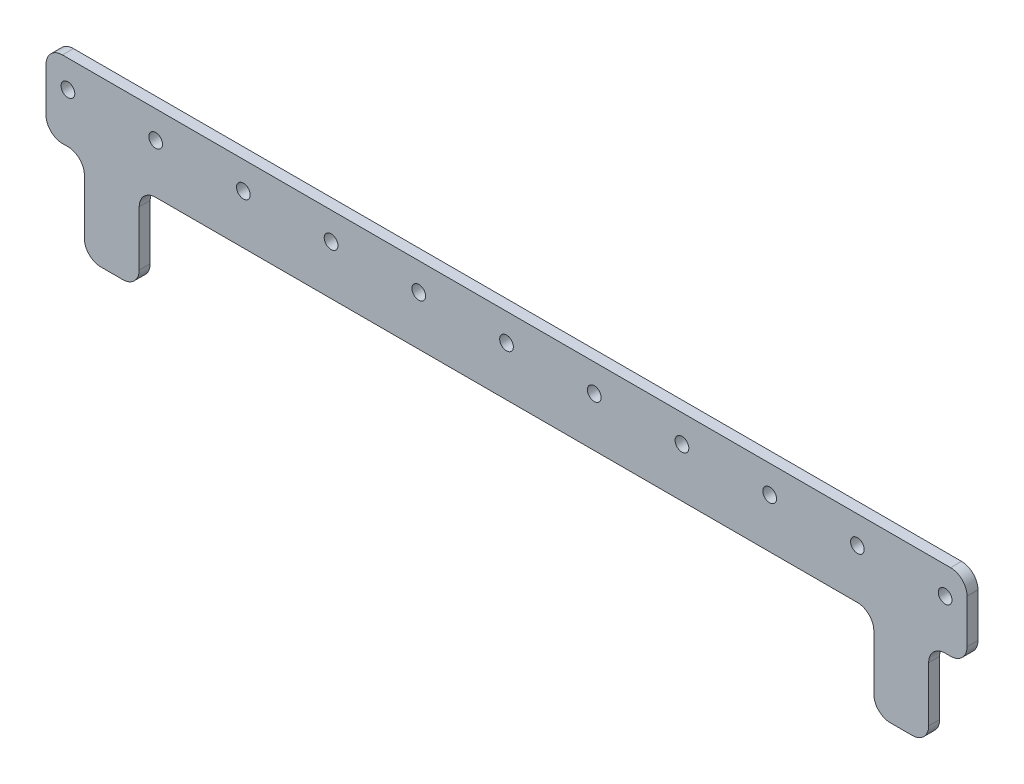
ISO-10303-21;
HEADER;
FILE_DESCRIPTION(('STEP AP214'),'2;1');
FILE_NAME('part.step','',(''),(''),'','','');
FILE_SCHEMA(('AUTOMOTIVE_DESIGN { 1 0 10303 214 1 1 1 1 }'));
ENDSEC;
DATA;
#1=APPLICATION_CONTEXT('core data for automotive mechanical design processes');
#2=APPLICATION_PROTOCOL_DEFINITION('international standard','automotive_design',2000,#1);
#3=PRODUCT_CONTEXT('',#1,'mechanical');
#4=PRODUCT('Part','Part','',(#3));
#5=PRODUCT_RELATED_PRODUCT_CATEGORY('part','',(#4));
#6=PRODUCT_DEFINITION_FORMATION('','',#4);
#7=PRODUCT_DEFINITION_CONTEXT('part definition',#1,'design');
#8=PRODUCT_DEFINITION('design','',#6,#7);
#9=PRODUCT_DEFINITION_SHAPE('','',#8);
#10=(LENGTH_UNIT() NAMED_UNIT(*) SI_UNIT(.MILLI.,.METRE.));
#11=(NAMED_UNIT(*) PLANE_ANGLE_UNIT() SI_UNIT($,.RADIAN.));
#12=(NAMED_UNIT(*) SI_UNIT($,.STERADIAN.) SOLID_ANGLE_UNIT());
#13=UNCERTAINTY_MEASURE_WITH_UNIT(LENGTH_MEASURE(1.E-05),#10,'distance_accuracy_value','');
#14=(GEOMETRIC_REPRESENTATION_CONTEXT(3) GLOBAL_UNCERTAINTY_ASSIGNED_CONTEXT((#13)) GLOBAL_UNIT_ASSIGNED_CONTEXT((#10,
#11,#12)) REPRESENTATION_CONTEXT('',''));
#15=CARTESIAN_POINT('',(0.,0.,0.));
#16=DIRECTION('',(0.,0.,1.));
#17=DIRECTION('',(1.,0.,0.));
#18=AXIS2_PLACEMENT_3D('',#15,#16,#17);
#19=CARTESIAN_POINT('',(-84.,-7.,-2.));
#20=DIRECTION('',(0.,-1.,0.));
#21=DIRECTION('',(0.,0.,-1.));
#22=AXIS2_PLACEMENT_3D('',#19,#20,#21);
#23=PLANE('',#22);
#24=DIRECTION('',(1.,0.,0.));
#25=VECTOR('',#24,1.);
#26=CARTESIAN_POINT('',(-84.,-7.,0.));
#27=LINE('',#26,#25);
#28=CARTESIAN_POINT('',(79.9999999999999,-7.,0.));
#29=VERTEX_POINT('',#28);
#30=CARTESIAN_POINT('',(80.9999999999999,-7.,0.));
#31=VERTEX_POINT('',#30);
#32=EDGE_CURVE('E324',#29,#31,#27,.T.);
#33=ORIENTED_EDGE('',*,*,#32,.F.);
#34=DIRECTION('',(0.,0.,1.));
#35=VECTOR('',#34,1.);
#36=CARTESIAN_POINT('',(80.,-7.,-2.));
#37=LINE('',#36,#35);
#38=CARTESIAN_POINT('',(79.9999999999999,-7.,-2.));
#39=VERTEX_POINT('',#38);
#40=EDGE_CURVE('E257',#29,#39,#37,.F.);
#41=ORIENTED_EDGE('',*,*,#40,.T.);
#42=DIRECTION('',(1.,0.,0.));
#43=VECTOR('',#42,1.);
#44=CARTESIAN_POINT('',(-84.,-7.,-2.));
#45=LINE('',#44,#43);
#46=CARTESIAN_POINT('',(80.9999999999999,-7.,-2.));
#47=VERTEX_POINT('',#46);
#48=EDGE_CURVE('E345',#39,#47,#45,.T.);
#49=ORIENTED_EDGE('',*,*,#48,.T.);
#50=DIRECTION('',(0.,0.,1.));
#51=VECTOR('',#50,1.);
#52=CARTESIAN_POINT('',(81.,-7.,-2.));
#53=LINE('',#52,#51);
#54=EDGE_CURVE('E254',#47,#31,#53,.T.);
#55=ORIENTED_EDGE('',*,*,#54,.T.);
#56=EDGE_LOOP('',(#33,#41,#49,#55));
#57=FACE_BOUND('',#56,.T.);
#58=ADVANCED_FACE('F35',(#57),#23,.T.);
#59=CARTESIAN_POINT('',(-81.,-7.,-2.));
#60=VERTEX_POINT('',#59);
#61=CARTESIAN_POINT('',(-80.,-7.,-2.));
#62=VERTEX_POINT('',#61);
#63=EDGE_CURVE('E394',#60,#62,#45,.T.);
#64=ORIENTED_EDGE('',*,*,#63,.T.);
#65=DIRECTION('',(0.,0.,-1.));
#66=VECTOR('',#65,1.);
#67=CARTESIAN_POINT('',(-80.,-7.,0.));
#68=LINE('',#67,#66);
#69=CARTESIAN_POINT('',(-80.,-7.,0.));
#70=VERTEX_POINT('',#69);
#71=EDGE_CURVE('E242',#62,#70,#68,.F.);
#72=ORIENTED_EDGE('',*,*,#71,.T.);
#73=CARTESIAN_POINT('',(-81.,-7.,0.));
#74=VERTEX_POINT('',#73);
#75=EDGE_CURVE('E335',#74,#70,#27,.T.);
#76=ORIENTED_EDGE('',*,*,#75,.F.);
#77=DIRECTION('',(0.,0.,1.));
#78=VECTOR('',#77,1.);
#79=CARTESIAN_POINT('',(-81.,-7.,-2.));
#80=LINE('',#79,#78);
#81=EDGE_CURVE('E240',#74,#60,#80,.F.);
#82=ORIENTED_EDGE('',*,*,#81,.T.);
#83=EDGE_LOOP('',(#64,#72,#76,#82));
#84=FACE_BOUND('',#83,.T.);
#85=ADVANCED_FACE('F476',(#84),#23,.T.);
#86=CARTESIAN_POINT('',(-80.,2.,-2.));
#87=DIRECTION('',(0.,0.,1.));
#88=DIRECTION('',(1.,0.,0.));
#89=AXIS2_PLACEMENT_3D('',#86,#87,#88);
#90=CYLINDRICAL_SURFACE('',#89,1.25);
#91=CARTESIAN_POINT('',(-80.,2.,-2.));
#92=DIRECTION('',(0.,0.,1.));
#93=DIRECTION('',(1.,0.,0.));
#94=AXIS2_PLACEMENT_3D('',#91,#92,#93);
#95=CIRCLE('',#94,1.25);
#96=CARTESIAN_POINT('',(-78.75,2.,-2.));
#97=VERTEX_POINT('',#96);
#98=EDGE_CURVE('E455',#97,#97,#95,.T.);
#99=ORIENTED_EDGE('',*,*,#98,.F.);
#100=EDGE_LOOP('',(#99));
#101=FACE_BOUND('',#100,.T.);
#102=CARTESIAN_POINT('',(-80.,2.,0.));
#103=DIRECTION('',(0.,0.,1.));
#104=DIRECTION('',(1.,0.,0.));
#105=AXIS2_PLACEMENT_3D('',#102,#103,#104);
#106=CIRCLE('',#105,1.25);
#107=CARTESIAN_POINT('',(-78.75,2.,0.));
#108=VERTEX_POINT('',#107);
#109=EDGE_CURVE('E229',#108,#108,#106,.T.);
#110=ORIENTED_EDGE('',*,*,#109,.T.);
#111=EDGE_LOOP('',(#110));
#112=FACE_BOUND('',#111,.T.);
#113=ADVANCED_FACE('F460',(#101,#112),#90,.F.);
#114=CARTESIAN_POINT('',(-64.,2.,-2.));
#115=DIRECTION('',(0.,0.,1.));
#116=DIRECTION('',(1.,0.,0.));
#117=AXIS2_PLACEMENT_3D('',#114,#115,#116);
#118=CYLINDRICAL_SURFACE('',#117,1.25);
#119=CARTESIAN_POINT('',(-64.,2.,-2.));
#120=DIRECTION('',(0.,0.,1.));
#121=DIRECTION('',(1.,0.,0.));
#122=AXIS2_PLACEMENT_3D('',#119,#120,#121);
#123=CIRCLE('',#122,1.25);
#124=CARTESIAN_POINT('',(-62.75,2.,-2.));
#125=VERTEX_POINT('',#124);
#126=EDGE_CURVE('E449',#125,#125,#123,.T.);
#127=ORIENTED_EDGE('',*,*,#126,.F.);
#128=EDGE_LOOP('',(#127));
#129=FACE_BOUND('',#128,.T.);
#130=CARTESIAN_POINT('',(-64.,2.,0.));
#131=DIRECTION('',(0.,0.,1.));
#132=DIRECTION('',(1.,0.,0.));
#133=AXIS2_PLACEMENT_3D('',#130,#131,#132);
#134=CIRCLE('',#133,1.25);
#135=CARTESIAN_POINT('',(-62.75,2.,0.));
#136=VERTEX_POINT('',#135);
#137=EDGE_CURVE('E452',#136,#136,#134,.T.);
#138=ORIENTED_EDGE('',*,*,#137,.T.);
#139=EDGE_LOOP('',(#138));
#140=FACE_BOUND('',#139,.T.);
#141=ADVANCED_FACE('F613',(#129,#140),#118,.F.);
#142=CARTESIAN_POINT('',(-48.,2.,-2.));
#143=DIRECTION('',(0.,0.,1.));
#144=DIRECTION('',(1.,0.,0.));
#145=AXIS2_PLACEMENT_3D('',#142,#143,#144);
#146=CYLINDRICAL_SURFACE('',#145,1.25);
#147=CARTESIAN_POINT('',(-48.,2.,-2.));
#148=DIRECTION('',(0.,0.,1.));
#149=DIRECTION('',(1.,0.,0.));
#150=AXIS2_PLACEMENT_3D('',#147,#148,#149);
#151=CIRCLE('',#150,1.25);
#152=CARTESIAN_POINT('',(-46.75,2.,-2.));
#153=VERTEX_POINT('',#152);
#154=EDGE_CURVE('E443',#153,#153,#151,.T.);
#155=ORIENTED_EDGE('',*,*,#154,.F.);
#156=EDGE_LOOP('',(#155));
#157=FACE_BOUND('',#156,.T.);
#158=CARTESIAN_POINT('',(-48.,2.,0.));
#159=DIRECTION('',(0.,0.,1.));
#160=DIRECTION('',(1.,0.,0.));
#161=AXIS2_PLACEMENT_3D('',#158,#159,#160);
#162=CIRCLE('',#161,1.25);
#163=CARTESIAN_POINT('',(-46.75,2.,0.));
#164=VERTEX_POINT('',#163);
#165=EDGE_CURVE('E446',#164,#164,#162,.T.);
#166=ORIENTED_EDGE('',*,*,#165,.T.);
#167=EDGE_LOOP('',(#166));
#168=FACE_BOUND('',#167,.T.);
#169=ADVANCED_FACE('F609',(#157,#168),#146,.F.);
#170=CARTESIAN_POINT('',(-32.,2.,-2.));
#171=DIRECTION('',(0.,0.,1.));
#172=DIRECTION('',(1.,0.,0.));
#173=AXIS2_PLACEMENT_3D('',#170,#171,#172);
#174=CYLINDRICAL_SURFACE('',#173,1.25);
#175=CARTESIAN_POINT('',(-32.,2.,-2.));
#176=DIRECTION('',(0.,0.,1.));
#177=DIRECTION('',(1.,0.,0.));
#178=AXIS2_PLACEMENT_3D('',#175,#176,#177);
#179=CIRCLE('',#178,1.25);
#180=CARTESIAN_POINT('',(-30.75,2.,-2.));
#181=VERTEX_POINT('',#180);
#182=EDGE_CURVE('E437',#181,#181,#179,.T.);
#183=ORIENTED_EDGE('',*,*,#182,.F.);
#184=EDGE_LOOP('',(#183));
#185=FACE_BOUND('',#184,.T.);
#186=CARTESIAN_POINT('',(-32.,2.,0.));
#187=DIRECTION('',(0.,0.,1.));
#188=DIRECTION('',(1.,0.,0.));
#189=AXIS2_PLACEMENT_3D('',#186,#187,#188);
#190=CIRCLE('',#189,1.25);
#191=CARTESIAN_POINT('',(-30.75,2.,0.));
#192=VERTEX_POINT('',#191);
#193=EDGE_CURVE('E440',#192,#192,#190,.T.);
#194=ORIENTED_EDGE('',*,*,#193,.T.);
#195=EDGE_LOOP('',(#194));
#196=FACE_BOUND('',#195,.T.);
#197=ADVANCED_FACE('F605',(#185,#196),#174,.F.);
#198=CARTESIAN_POINT('',(-16.,2.,-2.));
#199=DIRECTION('',(0.,0.,1.));
#200=DIRECTION('',(1.,0.,0.));
#201=AXIS2_PLACEMENT_3D('',#198,#199,#200);
#202=CYLINDRICAL_SURFACE('',#201,1.25);
#203=CARTESIAN_POINT('',(-16.,2.,-2.));
#204=DIRECTION('',(0.,0.,1.));
#205=DIRECTION('',(1.,0.,0.));
#206=AXIS2_PLACEMENT_3D('',#203,#204,#205);
#207=CIRCLE('',#206,1.25);
#208=CARTESIAN_POINT('',(-14.75,2.,-2.));
#209=VERTEX_POINT('',#208);
#210=EDGE_CURVE('E431',#209,#209,#207,.T.);
#211=ORIENTED_EDGE('',*,*,#210,.F.);
#212=EDGE_LOOP('',(#211));
#213=FACE_BOUND('',#212,.T.);
#214=CARTESIAN_POINT('',(-16.,2.,0.));
#215=DIRECTION('',(0.,0.,1.));
#216=DIRECTION('',(1.,0.,0.));
#217=AXIS2_PLACEMENT_3D('',#214,#215,#216);
#218=CIRCLE('',#217,1.25);
#219=CARTESIAN_POINT('',(-14.75,2.,0.));
#220=VERTEX_POINT('',#219);
#221=EDGE_CURVE('E434',#220,#220,#218,.T.);
#222=ORIENTED_EDGE('',*,*,#221,.T.);
#223=EDGE_LOOP('',(#222));
#224=FACE_BOUND('',#223,.T.);
#225=ADVANCED_FACE('F601',(#213,#224),#202,.F.);
#226=CARTESIAN_POINT('',(0.,2.,-2.));
#227=DIRECTION('',(0.,0.,1.));
#228=DIRECTION('',(1.,0.,0.));
#229=AXIS2_PLACEMENT_3D('',#226,#227,#228);
#230=CYLINDRICAL_SURFACE('',#229,1.25);
#231=CARTESIAN_POINT('',(0.,2.,-2.));
#232=DIRECTION('',(0.,0.,1.));
#233=DIRECTION('',(1.,0.,0.));
#234=AXIS2_PLACEMENT_3D('',#231,#232,#233);
#235=CIRCLE('',#234,1.25);
#236=CARTESIAN_POINT('',(1.24999999999998,2.,-2.));
#237=VERTEX_POINT('',#236);
#238=EDGE_CURVE('E425',#237,#237,#235,.T.);
#239=ORIENTED_EDGE('',*,*,#238,.F.);
#240=EDGE_LOOP('',(#239));
#241=FACE_BOUND('',#240,.T.);
#242=CARTESIAN_POINT('',(0.,2.,0.));
#243=DIRECTION('',(0.,0.,1.));
#244=DIRECTION('',(1.,0.,0.));
#245=AXIS2_PLACEMENT_3D('',#242,#243,#244);
#246=CIRCLE('',#245,1.25);
#247=CARTESIAN_POINT('',(1.24999999999998,2.,0.));
#248=VERTEX_POINT('',#247);
#249=EDGE_CURVE('E428',#248,#248,#246,.T.);
#250=ORIENTED_EDGE('',*,*,#249,.T.);
#251=EDGE_LOOP('',(#250));
#252=FACE_BOUND('',#251,.T.);
#253=ADVANCED_FACE('F597',(#241,#252),#230,.F.);
#254=CARTESIAN_POINT('',(16.,2.,-2.));
#255=DIRECTION('',(0.,0.,1.));
#256=DIRECTION('',(1.,0.,0.));
#257=AXIS2_PLACEMENT_3D('',#254,#255,#256);
#258=CYLINDRICAL_SURFACE('',#257,1.25);
#259=CARTESIAN_POINT('',(16.,2.,-2.));
#260=DIRECTION('',(0.,0.,1.));
#261=DIRECTION('',(1.,0.,0.));
#262=AXIS2_PLACEMENT_3D('',#259,#260,#261);
#263=CIRCLE('',#262,1.25);
#264=CARTESIAN_POINT('',(17.25,2.,-2.));
#265=VERTEX_POINT('',#264);
#266=EDGE_CURVE('E419',#265,#265,#263,.T.);
#267=ORIENTED_EDGE('',*,*,#266,.F.);
#268=EDGE_LOOP('',(#267));
#269=FACE_BOUND('',#268,.T.);
#270=CARTESIAN_POINT('',(16.,2.,0.));
#271=DIRECTION('',(0.,0.,1.));
#272=DIRECTION('',(1.,0.,0.));
#273=AXIS2_PLACEMENT_3D('',#270,#271,#272);
#274=CIRCLE('',#273,1.25);
#275=CARTESIAN_POINT('',(17.25,2.,0.));
#276=VERTEX_POINT('',#275);
#277=EDGE_CURVE('E422',#276,#276,#274,.T.);
#278=ORIENTED_EDGE('',*,*,#277,.T.);
#279=EDGE_LOOP('',(#278));
#280=FACE_BOUND('',#279,.T.);
#281=ADVANCED_FACE('F593',(#269,#280),#258,.F.);
#282=CARTESIAN_POINT('',(32.,2.,-2.));
#283=DIRECTION('',(0.,0.,1.));
#284=DIRECTION('',(1.,0.,0.));
#285=AXIS2_PLACEMENT_3D('',#282,#283,#284);
#286=CYLINDRICAL_SURFACE('',#285,1.25);
#287=CARTESIAN_POINT('',(32.,2.,-2.));
#288=DIRECTION('',(0.,0.,1.));
#289=DIRECTION('',(1.,0.,0.));
#290=AXIS2_PLACEMENT_3D('',#287,#288,#289);
#291=CIRCLE('',#290,1.25);
#292=CARTESIAN_POINT('',(33.25,2.,-2.));
#293=VERTEX_POINT('',#292);
#294=EDGE_CURVE('E413',#293,#293,#291,.T.);
#295=ORIENTED_EDGE('',*,*,#294,.F.);
#296=EDGE_LOOP('',(#295));
#297=FACE_BOUND('',#296,.T.);
#298=CARTESIAN_POINT('',(32.,2.,0.));
#299=DIRECTION('',(0.,0.,1.));
#300=DIRECTION('',(1.,0.,0.));
#301=AXIS2_PLACEMENT_3D('',#298,#299,#300);
#302=CIRCLE('',#301,1.25);
#303=CARTESIAN_POINT('',(33.25,2.,0.));
#304=VERTEX_POINT('',#303);
#305=EDGE_CURVE('E416',#304,#304,#302,.T.);
#306=ORIENTED_EDGE('',*,*,#305,.T.);
#307=EDGE_LOOP('',(#306));
#308=FACE_BOUND('',#307,.T.);
#309=ADVANCED_FACE('F587',(#297,#308),#286,.F.);
#310=CARTESIAN_POINT('',(48.,2.,-2.));
#311=DIRECTION('',(0.,0.,1.));
#312=DIRECTION('',(1.,0.,0.));
#313=AXIS2_PLACEMENT_3D('',#310,#311,#312);
#314=CYLINDRICAL_SURFACE('',#313,1.25);
#315=CARTESIAN_POINT('',(48.,2.,-2.));
#316=DIRECTION('',(0.,0.,1.));
#317=DIRECTION('',(1.,0.,0.));
#318=AXIS2_PLACEMENT_3D('',#315,#316,#317);
#319=CIRCLE('',#318,1.25);
#320=CARTESIAN_POINT('',(49.25,2.,-2.));
#321=VERTEX_POINT('',#320);
#322=EDGE_CURVE('E400',#321,#321,#319,.T.);
#323=ORIENTED_EDGE('',*,*,#322,.F.);
#324=EDGE_LOOP('',(#323));
#325=FACE_BOUND('',#324,.T.);
#326=CARTESIAN_POINT('',(48.,2.,0.));
#327=DIRECTION('',(0.,0.,1.));
#328=DIRECTION('',(1.,0.,0.));
#329=AXIS2_PLACEMENT_3D('',#326,#327,#328);
#330=CIRCLE('',#329,1.25);
#331=CARTESIAN_POINT('',(49.25,2.,0.));
#332=VERTEX_POINT('',#331);
#333=EDGE_CURVE('E410',#332,#332,#330,.T.);
#334=ORIENTED_EDGE('',*,*,#333,.T.);
#335=EDGE_LOOP('',(#334));
#336=FACE_BOUND('',#335,.T.);
#337=ADVANCED_FACE('F583',(#325,#336),#314,.F.);
#338=CARTESIAN_POINT('',(-84.,7.,-2.));
#339=DIRECTION('',(-1.,0.,0.));
#340=DIRECTION('',(0.,0.,1.));
#341=AXIS2_PLACEMENT_3D('',#338,#339,#340);
#342=PLANE('',#341);
#343=DIRECTION('',(0.,-1.,0.));
#344=VECTOR('',#343,1.);
#345=CARTESIAN_POINT('',(-84.,7.,-2.));
#346=LINE('',#345,#344);
#347=CARTESIAN_POINT('',(-84.,4.,-2.));
#348=VERTEX_POINT('',#347);
#349=CARTESIAN_POINT('',(-84.,-4.,-2.));
#350=VERTEX_POINT('',#349);
#351=EDGE_CURVE('E388',#348,#350,#346,.T.);
#352=ORIENTED_EDGE('',*,*,#351,.T.);
#353=DIRECTION('',(0.,0.,1.));
#354=VECTOR('',#353,1.);
#355=CARTESIAN_POINT('',(-84.,-4.,-2.));
#356=LINE('',#355,#354);
#357=CARTESIAN_POINT('',(-84.,-4.,0.));
#358=VERTEX_POINT('',#357);
#359=EDGE_CURVE('E311',#350,#358,#356,.T.);
#360=ORIENTED_EDGE('',*,*,#359,.T.);
#361=DIRECTION('',(0.,-1.,0.));
#362=VECTOR('',#361,1.);
#363=CARTESIAN_POINT('',(-84.,7.,0.));
#364=LINE('',#363,#362);
#365=CARTESIAN_POINT('',(-84.,4.,0.));
#366=VERTEX_POINT('',#365);
#367=EDGE_CURVE('E333',#366,#358,#364,.T.);
#368=ORIENTED_EDGE('',*,*,#367,.F.);
#369=DIRECTION('',(0.,0.,1.));
#370=VECTOR('',#369,1.);
#371=CARTESIAN_POINT('',(-84.,4.,-2.));
#372=LINE('',#371,#370);
#373=EDGE_CURVE('E309',#366,#348,#372,.F.);
#374=ORIENTED_EDGE('',*,*,#373,.T.);
#375=EDGE_LOOP('',(#352,#360,#368,#374));
#376=FACE_BOUND('',#375,.T.);
#377=ADVANCED_FACE('F570',(#376),#342,.T.);
#378=CARTESIAN_POINT('',(-84.,7.,-2.));
#379=DIRECTION('',(0.,1.,0.));
#380=DIRECTION('',(0.,0.,1.));
#381=AXIS2_PLACEMENT_3D('',#378,#379,#380);
#382=PLANE('',#381);
#383=DIRECTION('',(-1.,0.,0.));
#384=VECTOR('',#383,1.);
#385=CARTESIAN_POINT('',(-84.,7.,0.));
#386=LINE('',#385,#384);
#387=CARTESIAN_POINT('',(80.9999999999999,7.,0.));
#388=VERTEX_POINT('',#387);
#389=CARTESIAN_POINT('',(-81.,7.,0.));
#390=VERTEX_POINT('',#389);
#391=EDGE_CURVE('E391',#388,#390,#386,.T.);
#392=ORIENTED_EDGE('',*,*,#391,.F.);
#393=DIRECTION('',(0.,0.,1.));
#394=VECTOR('',#393,1.);
#395=CARTESIAN_POINT('',(81.,7.,-2.));
#396=LINE('',#395,#394);
#397=CARTESIAN_POINT('',(80.9999999999999,7.,-2.));
#398=VERTEX_POINT('',#397);
#399=EDGE_CURVE('E307',#388,#398,#396,.F.);
#400=ORIENTED_EDGE('',*,*,#399,.T.);
#401=DIRECTION('',(-1.,0.,0.));
#402=VECTOR('',#401,1.);
#403=CARTESIAN_POINT('',(-84.,7.,-2.));
#404=LINE('',#403,#402);
#405=CARTESIAN_POINT('',(-81.,7.,-2.));
#406=VERTEX_POINT('',#405);
#407=EDGE_CURVE('E397',#398,#406,#404,.T.);
#408=ORIENTED_EDGE('',*,*,#407,.T.);
#409=DIRECTION('',(0.,0.,1.));
#410=VECTOR('',#409,1.);
#411=CARTESIAN_POINT('',(-81.,7.,-2.));
#412=LINE('',#411,#410);
#413=EDGE_CURVE('E304',#406,#390,#412,.T.);
#414=ORIENTED_EDGE('',*,*,#413,.T.);
#415=EDGE_LOOP('',(#392,#400,#408,#414));
#416=FACE_BOUND('',#415,.T.);
#417=ADVANCED_FACE('F490',(#416),#382,.T.);
#418=CARTESIAN_POINT('',(84.,7.,-2.));
#419=DIRECTION('',(1.,0.,0.));
#420=DIRECTION('',(0.,0.,-1.));
#421=AXIS2_PLACEMENT_3D('',#418,#419,#420);
#422=PLANE('',#421);
#423=DIRECTION('',(0.,1.,0.));
#424=VECTOR('',#423,1.);
#425=CARTESIAN_POINT('',(84.,7.,-2.));
#426=LINE('',#425,#424);
#427=CARTESIAN_POINT('',(84.,-4.,-2.));
#428=VERTEX_POINT('',#427);
#429=CARTESIAN_POINT('',(84.,4.,-2.));
#430=VERTEX_POINT('',#429);
#431=EDGE_CURVE('E395',#428,#430,#426,.T.);
#432=ORIENTED_EDGE('',*,*,#431,.T.);
#433=DIRECTION('',(0.,0.,1.));
#434=VECTOR('',#433,1.);
#435=CARTESIAN_POINT('',(84.,4.,-2.));
#436=LINE('',#435,#434);
#437=CARTESIAN_POINT('',(84.,4.,0.));
#438=VERTEX_POINT('',#437);
#439=EDGE_CURVE('E301',#430,#438,#436,.T.);
#440=ORIENTED_EDGE('',*,*,#439,.T.);
#441=DIRECTION('',(0.,1.,0.));
#442=VECTOR('',#441,1.);
#443=CARTESIAN_POINT('',(84.,7.,0.));
#444=LINE('',#443,#442);
#445=CARTESIAN_POINT('',(84.,-4.,0.));
#446=VERTEX_POINT('',#445);
#447=EDGE_CURVE('E403',#446,#438,#444,.T.);
#448=ORIENTED_EDGE('',*,*,#447,.F.);
#449=DIRECTION('',(0.,0.,1.));
#450=VECTOR('',#449,1.);
#451=CARTESIAN_POINT('',(84.,-4.,-2.));
#452=LINE('',#451,#450);
#453=EDGE_CURVE('E57',#446,#428,#452,.F.);
#454=ORIENTED_EDGE('',*,*,#453,.T.);
#455=EDGE_LOOP('',(#432,#440,#448,#454));
#456=FACE_BOUND('',#455,.T.);
#457=ADVANCED_FACE('F485',(#456),#422,.T.);
#458=CARTESIAN_POINT('',(-64.,-7.,-2.));
#459=VERTEX_POINT('',#458);
#460=CARTESIAN_POINT('',(63.9999999999999,-7.,-2.));
#461=VERTEX_POINT('',#460);
#462=EDGE_CURVE('E393',#459,#461,#45,.T.);
#463=ORIENTED_EDGE('',*,*,#462,.T.);
#464=DIRECTION('',(0.,0.,-1.));
#465=VECTOR('',#464,1.);
#466=CARTESIAN_POINT('',(64.,-7.,0.));
#467=LINE('',#466,#465);
#468=CARTESIAN_POINT('',(63.9999999999999,-7.,0.));
#469=VERTEX_POINT('',#468);
#470=EDGE_CURVE('E227',#461,#469,#467,.F.);
#471=ORIENTED_EDGE('',*,*,#470,.T.);
#472=CARTESIAN_POINT('',(-64.,-7.,0.));
#473=VERTEX_POINT('',#472);
#474=EDGE_CURVE('E205',#473,#469,#27,.T.);
#475=ORIENTED_EDGE('',*,*,#474,.F.);
#476=DIRECTION('',(0.,0.,1.));
#477=VECTOR('',#476,1.);
#478=CARTESIAN_POINT('',(-64.,-7.,-2.));
#479=LINE('',#478,#477);
#480=EDGE_CURVE('E225',#473,#459,#479,.F.);
#481=ORIENTED_EDGE('',*,*,#480,.T.);
#482=EDGE_LOOP('',(#463,#471,#475,#481));
#483=FACE_BOUND('',#482,.T.);
#484=ADVANCED_FACE('F472',(#483),#23,.T.);
#485=CARTESIAN_POINT('',(0.,0.,-2.));
#486=DIRECTION('',(0.,0.,1.));
#487=DIRECTION('',(1.,0.,0.));
#488=AXIS2_PLACEMENT_3D('',#485,#486,#487);
#489=PLANE('',#488);
#490=DIRECTION('',(-1.,0.,0.));
#491=VECTOR('',#490,1.);
#492=CARTESIAN_POINT('',(-67.,-23.,-2.));
#493=LINE('',#492,#491);
#494=CARTESIAN_POINT('',(-70.,-23.,-2.));
#495=VERTEX_POINT('',#494);
#496=CARTESIAN_POINT('',(-74.,-23.,-2.));
#497=VERTEX_POINT('',#496);
#498=EDGE_CURVE('E368',#495,#497,#493,.T.);
#499=ORIENTED_EDGE('',*,*,#498,.T.);
#500=CARTESIAN_POINT('',(-74.,-20.,-2.));
#501=DIRECTION('',(0.,0.,1.));
#502=DIRECTION('',(1.,0.,0.));
#503=AXIS2_PLACEMENT_3D('',#500,#501,#502);
#504=CIRCLE('',#503,3.);
#505=CARTESIAN_POINT('',(-77.,-20.,-2.));
#506=VERTEX_POINT('',#505);
#507=EDGE_CURVE('E293',#497,#506,#504,.F.);
#508=ORIENTED_EDGE('',*,*,#507,.T.);
#509=DIRECTION('',(0.,1.,0.));
#510=VECTOR('',#509,1.);
#511=CARTESIAN_POINT('',(-77.,-23.,-2.));
#512=LINE('',#511,#510);
#513=CARTESIAN_POINT('',(-77.,-10.,-2.));
#514=VERTEX_POINT('',#513);
#515=EDGE_CURVE('E362',#506,#514,#512,.T.);
#516=ORIENTED_EDGE('',*,*,#515,.T.);
#517=CARTESIAN_POINT('',(-80.,-10.,-2.));
#518=DIRECTION('',(0.,0.,1.));
#519=DIRECTION('',(1.,0.,0.));
#520=AXIS2_PLACEMENT_3D('',#517,#518,#519);
#521=CIRCLE('',#520,3.);
#522=EDGE_CURVE('E209',#514,#62,#521,.T.);
#523=ORIENTED_EDGE('',*,*,#522,.T.);
#524=ORIENTED_EDGE('',*,*,#63,.F.);
#525=CARTESIAN_POINT('',(-81.,-4.,-2.));
#526=DIRECTION('',(0.,0.,1.));
#527=DIRECTION('',(1.,0.,0.));
#528=AXIS2_PLACEMENT_3D('',#525,#526,#527);
#529=CIRCLE('',#528,3.);
#530=EDGE_CURVE('E282',#60,#350,#529,.F.);
#531=ORIENTED_EDGE('',*,*,#530,.T.);
#532=ORIENTED_EDGE('',*,*,#351,.F.);
#533=CARTESIAN_POINT('',(-81.,4.,-2.));
#534=DIRECTION('',(0.,0.,1.));
#535=DIRECTION('',(1.,0.,0.));
#536=AXIS2_PLACEMENT_3D('',#533,#534,#535);
#537=CIRCLE('',#536,3.);
#538=EDGE_CURVE('E280',#348,#406,#537,.F.);
#539=ORIENTED_EDGE('',*,*,#538,.T.);
#540=ORIENTED_EDGE('',*,*,#407,.F.);
#541=CARTESIAN_POINT('',(81.,4.,-2.));
#542=DIRECTION('',(0.,0.,1.));
#543=DIRECTION('',(1.,0.,0.));
#544=AXIS2_PLACEMENT_3D('',#541,#542,#543);
#545=CIRCLE('',#544,3.);
#546=EDGE_CURVE('E50',#398,#430,#545,.F.);
#547=ORIENTED_EDGE('',*,*,#546,.T.);
#548=ORIENTED_EDGE('',*,*,#431,.F.);
#549=CARTESIAN_POINT('',(81.,-4.,-2.));
#550=DIRECTION('',(0.,0.,1.));
#551=DIRECTION('',(1.,0.,0.));
#552=AXIS2_PLACEMENT_3D('',#549,#550,#551);
#553=CIRCLE('',#552,3.);
#554=EDGE_CURVE('E284',#428,#47,#553,.F.);
#555=ORIENTED_EDGE('',*,*,#554,.T.);
#556=ORIENTED_EDGE('',*,*,#48,.F.);
#557=CARTESIAN_POINT('',(80.,-10.,-2.));
#558=DIRECTION('',(0.,0.,1.));
#559=DIRECTION('',(1.,0.,0.));
#560=AXIS2_PLACEMENT_3D('',#557,#558,#559);
#561=CIRCLE('',#560,3.);
#562=CARTESIAN_POINT('',(77.,-10.,-2.));
#563=VERTEX_POINT('',#562);
#564=EDGE_CURVE('E11',#39,#563,#561,.T.);
#565=ORIENTED_EDGE('',*,*,#564,.T.);
#566=DIRECTION('',(0.,1.,0.));
#567=VECTOR('',#566,1.);
#568=CARTESIAN_POINT('',(77.,-23.,-2.));
#569=LINE('',#568,#567);
#570=CARTESIAN_POINT('',(77.,-20.,-2.));
#571=VERTEX_POINT('',#570);
#572=EDGE_CURVE('E343',#571,#563,#569,.T.);
#573=ORIENTED_EDGE('',*,*,#572,.F.);
#574=CARTESIAN_POINT('',(74.,-20.,-2.));
#575=DIRECTION('',(0.,0.,1.));
#576=DIRECTION('',(1.,0.,0.));
#577=AXIS2_PLACEMENT_3D('',#574,#575,#576);
#578=CIRCLE('',#577,3.);
#579=CARTESIAN_POINT('',(74.,-23.,-2.));
#580=VERTEX_POINT('',#579);
#581=EDGE_CURVE('E287',#571,#580,#578,.F.);
#582=ORIENTED_EDGE('',*,*,#581,.T.);
#583=DIRECTION('',(1.,0.,0.));
#584=VECTOR('',#583,1.);
#585=CARTESIAN_POINT('',(67.,-23.,-2.));
#586=LINE('',#585,#584);
#587=CARTESIAN_POINT('',(70.,-23.,-2.));
#588=VERTEX_POINT('',#587);
#589=EDGE_CURVE('E351',#588,#580,#586,.T.);
#590=ORIENTED_EDGE('',*,*,#589,.F.);
#591=CARTESIAN_POINT('',(70.,-20.,-2.));
#592=DIRECTION('',(0.,0.,1.));
#593=DIRECTION('',(1.,0.,0.));
#594=AXIS2_PLACEMENT_3D('',#591,#592,#593);
#595=CIRCLE('',#594,3.);
#596=CARTESIAN_POINT('',(67.,-20.,-2.));
#597=VERTEX_POINT('',#596);
#598=EDGE_CURVE('E289',#588,#597,#595,.F.);
#599=ORIENTED_EDGE('',*,*,#598,.T.);
#600=DIRECTION('',(0.,-1.,0.));
#601=VECTOR('',#600,1.);
#602=CARTESIAN_POINT('',(67.,2.,-2.));
#603=LINE('',#602,#601);
#604=CARTESIAN_POINT('',(67.,-10.,-2.));
#605=VERTEX_POINT('',#604);
#606=EDGE_CURVE('E349',#605,#597,#603,.T.);
#607=ORIENTED_EDGE('',*,*,#606,.F.);
#608=CARTESIAN_POINT('',(64.,-10.,-2.));
#609=DIRECTION('',(0.,0.,1.));
#610=DIRECTION('',(1.,0.,0.));
#611=AXIS2_PLACEMENT_3D('',#608,#609,#610);
#612=CIRCLE('',#611,3.);
#613=EDGE_CURVE('E210',#605,#461,#612,.T.);
#614=ORIENTED_EDGE('',*,*,#613,.T.);
#615=ORIENTED_EDGE('',*,*,#462,.F.);
#616=CARTESIAN_POINT('',(-64.,-10.,-2.));
#617=DIRECTION('',(0.,0.,1.));
#618=DIRECTION('',(1.,0.,0.));
#619=AXIS2_PLACEMENT_3D('',#616,#617,#618);
#620=CIRCLE('',#619,3.);
#621=CARTESIAN_POINT('',(-67.,-10.,-2.));
#622=VERTEX_POINT('',#621);
#623=EDGE_CURVE('E320',#459,#622,#620,.T.);
#624=ORIENTED_EDGE('',*,*,#623,.T.);
#625=DIRECTION('',(0.,-1.,0.));
#626=VECTOR('',#625,1.);
#627=CARTESIAN_POINT('',(-67.,2.,-2.));
#628=LINE('',#627,#626);
#629=CARTESIAN_POINT('',(-67.,-20.,-2.));
#630=VERTEX_POINT('',#629);
#631=EDGE_CURVE('E373',#622,#630,#628,.T.);
#632=ORIENTED_EDGE('',*,*,#631,.T.);
#633=CARTESIAN_POINT('',(-70.,-20.,-2.));
#634=DIRECTION('',(0.,0.,1.));
#635=DIRECTION('',(1.,0.,0.));
#636=AXIS2_PLACEMENT_3D('',#633,#634,#635);
#637=CIRCLE('',#636,3.);
#638=EDGE_CURVE('E291',#630,#495,#637,.F.);
#639=ORIENTED_EDGE('',*,*,#638,.T.);
#640=EDGE_LOOP('',(#499,#508,#516,#523,#524,#531,#532,#539,#540,#547,#548,#555,#556,#565,#573,
#582,#590,#599,#607,#614,#615,#624,#632,#639));
#641=FACE_BOUND('',#640,.T.);
#642=CARTESIAN_POINT('',(64.,2.,-2.));
#643=DIRECTION('',(0.,0.,1.));
#644=DIRECTION('',(1.,0.,0.));
#645=AXIS2_PLACEMENT_3D('',#642,#643,#644);
#646=CIRCLE('',#645,1.25);
#647=CARTESIAN_POINT('',(65.25,2.,-2.));
#648=VERTEX_POINT('',#647);
#649=EDGE_CURVE('E376',#648,#648,#646,.T.);
#650=ORIENTED_EDGE('',*,*,#649,.T.);
#651=EDGE_LOOP('',(#650));
#652=FACE_BOUND('',#651,.T.);
#653=CARTESIAN_POINT('',(80.,2.,-2.));
#654=DIRECTION('',(0.,0.,1.));
#655=DIRECTION('',(1.,0.,0.));
#656=AXIS2_PLACEMENT_3D('',#653,#654,#655);
#657=CIRCLE('',#656,1.25);
#658=CARTESIAN_POINT('',(81.25,2.,-2.));
#659=VERTEX_POINT('',#658);
#660=EDGE_CURVE('E383',#659,#659,#657,.T.);
#661=ORIENTED_EDGE('',*,*,#660,.T.);
#662=EDGE_LOOP('',(#661));
#663=FACE_BOUND('',#662,.T.);
#664=ORIENTED_EDGE('',*,*,#322,.T.);
#665=EDGE_LOOP('',(#664));
#666=FACE_BOUND('',#665,.T.);
#667=ORIENTED_EDGE('',*,*,#294,.T.);
#668=EDGE_LOOP('',(#667));
#669=FACE_BOUND('',#668,.T.);
#670=ORIENTED_EDGE('',*,*,#266,.T.);
#671=EDGE_LOOP('',(#670));
#672=FACE_BOUND('',#671,.T.);
#673=ORIENTED_EDGE('',*,*,#238,.T.);
#674=EDGE_LOOP('',(#673));
#675=FACE_BOUND('',#674,.T.);
#676=ORIENTED_EDGE('',*,*,#210,.T.);
#677=EDGE_LOOP('',(#676));
#678=FACE_BOUND('',#677,.T.);
#679=ORIENTED_EDGE('',*,*,#182,.T.);
#680=EDGE_LOOP('',(#679));
#681=FACE_BOUND('',#680,.T.);
#682=ORIENTED_EDGE('',*,*,#154,.T.);
#683=EDGE_LOOP('',(#682));
#684=FACE_BOUND('',#683,.T.);
#685=ORIENTED_EDGE('',*,*,#126,.T.);
#686=EDGE_LOOP('',(#685));
#687=FACE_BOUND('',#686,.T.);
#688=ORIENTED_EDGE('',*,*,#98,.T.);
#689=EDGE_LOOP('',(#688));
#690=FACE_BOUND('',#689,.T.);
#691=ADVANCED_FACE('F341',(#641,#652,#663,#666,#669,#672,#675,#678,#681,#684,#687,#690),#489,.F.);
#692=CARTESIAN_POINT('',(0.,0.,0.));
#693=DIRECTION('',(0.,0.,1.));
#694=DIRECTION('',(1.,0.,0.));
#695=AXIS2_PLACEMENT_3D('',#692,#693,#694);
#696=PLANE('',#695);
#697=DIRECTION('',(0.,1.,0.));
#698=VECTOR('',#697,1.);
#699=CARTESIAN_POINT('',(-77.,-23.,0.));
#700=LINE('',#699,#698);
#701=CARTESIAN_POINT('',(-77.,-20.,0.));
#702=VERTEX_POINT('',#701);
#703=CARTESIAN_POINT('',(-77.,-10.,0.));
#704=VERTEX_POINT('',#703);
#705=EDGE_CURVE('E358',#702,#704,#700,.T.);
#706=ORIENTED_EDGE('',*,*,#705,.F.);
#707=CARTESIAN_POINT('',(-74.,-20.,0.));
#708=DIRECTION('',(0.,0.,1.));
#709=DIRECTION('',(1.,0.,0.));
#710=AXIS2_PLACEMENT_3D('',#707,#708,#709);
#711=CIRCLE('',#710,3.);
#712=CARTESIAN_POINT('',(-74.,-23.,0.));
#713=VERTEX_POINT('',#712);
#714=EDGE_CURVE('E273',#702,#713,#711,.T.);
#715=ORIENTED_EDGE('',*,*,#714,.T.);
#716=DIRECTION('',(-1.,0.,0.));
#717=VECTOR('',#716,1.);
#718=CARTESIAN_POINT('',(-67.,-23.,0.));
#719=LINE('',#718,#717);
#720=CARTESIAN_POINT('',(-70.,-23.,0.));
#721=VERTEX_POINT('',#720);
#722=EDGE_CURVE('E365',#721,#713,#719,.T.);
#723=ORIENTED_EDGE('',*,*,#722,.F.);
#724=CARTESIAN_POINT('',(-70.,-20.,0.));
#725=DIRECTION('',(0.,0.,1.));
#726=DIRECTION('',(1.,0.,0.));
#727=AXIS2_PLACEMENT_3D('',#724,#725,#726);
#728=CIRCLE('',#727,3.);
#729=CARTESIAN_POINT('',(-67.,-20.,0.));
#730=VERTEX_POINT('',#729);
#731=EDGE_CURVE('E271',#721,#730,#728,.T.);
#732=ORIENTED_EDGE('',*,*,#731,.T.);
#733=DIRECTION('',(0.,-1.,0.));
#734=VECTOR('',#733,1.);
#735=CARTESIAN_POINT('',(-67.,2.,0.));
#736=LINE('',#735,#734);
#737=CARTESIAN_POINT('',(-67.,-10.,0.));
#738=VERTEX_POINT('',#737);
#739=EDGE_CURVE('E370',#738,#730,#736,.T.);
#740=ORIENTED_EDGE('',*,*,#739,.F.);
#741=CARTESIAN_POINT('',(-64.,-10.,0.));
#742=DIRECTION('',(0.,0.,1.));
#743=DIRECTION('',(1.,0.,0.));
#744=AXIS2_PLACEMENT_3D('',#741,#742,#743);
#745=CIRCLE('',#744,3.);
#746=EDGE_CURVE('E318',#738,#473,#745,.F.);
#747=ORIENTED_EDGE('',*,*,#746,.T.);
#748=ORIENTED_EDGE('',*,*,#474,.T.);
#749=CARTESIAN_POINT('',(64.,-10.,0.));
#750=DIRECTION('',(0.,0.,1.));
#751=DIRECTION('',(1.,0.,0.));
#752=AXIS2_PLACEMENT_3D('',#749,#750,#751);
#753=CIRCLE('',#752,3.);
#754=CARTESIAN_POINT('',(67.,-10.,0.));
#755=VERTEX_POINT('',#754);
#756=EDGE_CURVE('E198',#469,#755,#753,.F.);
#757=ORIENTED_EDGE('',*,*,#756,.T.);
#758=DIRECTION('',(0.,-1.,0.));
#759=VECTOR('',#758,1.);
#760=CARTESIAN_POINT('',(67.,2.,0.));
#761=LINE('',#760,#759);
#762=CARTESIAN_POINT('',(67.,-20.,0.));
#763=VERTEX_POINT('',#762);
#764=EDGE_CURVE('E203',#755,#763,#761,.T.);
#765=ORIENTED_EDGE('',*,*,#764,.T.);
#766=CARTESIAN_POINT('',(70.,-20.,0.));
#767=DIRECTION('',(0.,0.,1.));
#768=DIRECTION('',(1.,0.,0.));
#769=AXIS2_PLACEMENT_3D('',#766,#767,#768);
#770=CIRCLE('',#769,3.);
#771=CARTESIAN_POINT('',(70.,-23.,0.));
#772=VERTEX_POINT('',#771);
#773=EDGE_CURVE('E269',#763,#772,#770,.T.);
#774=ORIENTED_EDGE('',*,*,#773,.T.);
#775=DIRECTION('',(1.,0.,0.));
#776=VECTOR('',#775,1.);
#777=CARTESIAN_POINT('',(67.,-23.,0.));
#778=LINE('',#777,#776);
#779=CARTESIAN_POINT('',(74.,-23.,0.));
#780=VERTEX_POINT('',#779);
#781=EDGE_CURVE('E221',#772,#780,#778,.T.);
#782=ORIENTED_EDGE('',*,*,#781,.T.);
#783=CARTESIAN_POINT('',(74.,-20.,0.));
#784=DIRECTION('',(0.,0.,1.));
#785=DIRECTION('',(1.,0.,0.));
#786=AXIS2_PLACEMENT_3D('',#783,#784,#785);
#787=CIRCLE('',#786,3.);
#788=CARTESIAN_POINT('',(77.,-20.,0.));
#789=VERTEX_POINT('',#788);
#790=EDGE_CURVE('E267',#780,#789,#787,.T.);
#791=ORIENTED_EDGE('',*,*,#790,.T.);
#792=DIRECTION('',(0.,1.,0.));
#793=VECTOR('',#792,1.);
#794=CARTESIAN_POINT('',(77.,-23.,0.));
#795=LINE('',#794,#793);
#796=CARTESIAN_POINT('',(77.,-10.,0.));
#797=VERTEX_POINT('',#796);
#798=EDGE_CURVE('E222',#789,#797,#795,.T.);
#799=ORIENTED_EDGE('',*,*,#798,.T.);
#800=CARTESIAN_POINT('',(80.,-10.,0.));
#801=DIRECTION('',(0.,0.,1.));
#802=DIRECTION('',(1.,0.,0.));
#803=AXIS2_PLACEMENT_3D('',#800,#801,#802);
#804=CIRCLE('',#803,3.);
#805=EDGE_CURVE('E43',#797,#29,#804,.F.);
#806=ORIENTED_EDGE('',*,*,#805,.T.);
#807=ORIENTED_EDGE('',*,*,#32,.T.);
#808=CARTESIAN_POINT('',(81.,-4.,0.));
#809=DIRECTION('',(0.,0.,1.));
#810=DIRECTION('',(1.,0.,0.));
#811=AXIS2_PLACEMENT_3D('',#808,#809,#810);
#812=CIRCLE('',#811,3.);
#813=EDGE_CURVE('E263',#31,#446,#812,.T.);
#814=ORIENTED_EDGE('',*,*,#813,.T.);
#815=ORIENTED_EDGE('',*,*,#447,.T.);
#816=CARTESIAN_POINT('',(81.,4.,0.));
#817=DIRECTION('',(0.,0.,1.));
#818=DIRECTION('',(1.,0.,0.));
#819=AXIS2_PLACEMENT_3D('',#816,#817,#818);
#820=CIRCLE('',#819,3.);
#821=EDGE_CURVE('E265',#438,#388,#820,.T.);
#822=ORIENTED_EDGE('',*,*,#821,.T.);
#823=ORIENTED_EDGE('',*,*,#391,.T.);
#824=CARTESIAN_POINT('',(-81.,4.,0.));
#825=DIRECTION('',(0.,0.,1.));
#826=DIRECTION('',(1.,0.,0.));
#827=AXIS2_PLACEMENT_3D('',#824,#825,#826);
#828=CIRCLE('',#827,3.);
#829=EDGE_CURVE('E259',#390,#366,#828,.T.);
#830=ORIENTED_EDGE('',*,*,#829,.T.);
#831=ORIENTED_EDGE('',*,*,#367,.T.);
#832=CARTESIAN_POINT('',(-81.,-4.,0.));
#833=DIRECTION('',(0.,0.,1.));
#834=DIRECTION('',(1.,0.,0.));
#835=AXIS2_PLACEMENT_3D('',#832,#833,#834);
#836=CIRCLE('',#835,3.);
#837=EDGE_CURVE('E261',#358,#74,#836,.T.);
#838=ORIENTED_EDGE('',*,*,#837,.T.);
#839=ORIENTED_EDGE('',*,*,#75,.T.);
#840=CARTESIAN_POINT('',(-80.,-10.,0.));
#841=DIRECTION('',(0.,0.,1.));
#842=DIRECTION('',(1.,0.,0.));
#843=AXIS2_PLACEMENT_3D('',#840,#841,#842);
#844=CIRCLE('',#843,3.);
#845=EDGE_CURVE('E316',#70,#704,#844,.F.);
#846=ORIENTED_EDGE('',*,*,#845,.T.);
#847=EDGE_LOOP('',(#706,#715,#723,#732,#740,#747,#748,#757,#765,#774,#782,#791,#799,#806,#807,
#814,#815,#822,#823,#830,#831,#838,#839,#846));
#848=FACE_BOUND('',#847,.T.);
#849=CARTESIAN_POINT('',(64.,2.,0.));
#850=DIRECTION('',(0.,0.,1.));
#851=DIRECTION('',(1.,0.,0.));
#852=AXIS2_PLACEMENT_3D('',#849,#850,#851);
#853=CIRCLE('',#852,1.25);
#854=CARTESIAN_POINT('',(65.25,2.,0.));
#855=VERTEX_POINT('',#854);
#856=EDGE_CURVE('E379',#855,#855,#853,.T.);
#857=ORIENTED_EDGE('',*,*,#856,.F.);
#858=EDGE_LOOP('',(#857));
#859=FACE_BOUND('',#858,.T.);
#860=CARTESIAN_POINT('',(80.,2.,0.));
#861=DIRECTION('',(0.,0.,1.));
#862=DIRECTION('',(1.,0.,0.));
#863=AXIS2_PLACEMENT_3D('',#860,#861,#862);
#864=CIRCLE('',#863,1.25);
#865=CARTESIAN_POINT('',(81.25,2.,0.));
#866=VERTEX_POINT('',#865);
#867=EDGE_CURVE('E382',#866,#866,#864,.T.);
#868=ORIENTED_EDGE('',*,*,#867,.F.);
#869=EDGE_LOOP('',(#868));
#870=FACE_BOUND('',#869,.T.);
#871=ORIENTED_EDGE('',*,*,#333,.F.);
#872=EDGE_LOOP('',(#871));
#873=FACE_BOUND('',#872,.T.);
#874=ORIENTED_EDGE('',*,*,#305,.F.);
#875=EDGE_LOOP('',(#874));
#876=FACE_BOUND('',#875,.T.);
#877=ORIENTED_EDGE('',*,*,#277,.F.);
#878=EDGE_LOOP('',(#877));
#879=FACE_BOUND('',#878,.T.);
#880=ORIENTED_EDGE('',*,*,#249,.F.);
#881=EDGE_LOOP('',(#880));
#882=FACE_BOUND('',#881,.T.);
#883=ORIENTED_EDGE('',*,*,#221,.F.);
#884=EDGE_LOOP('',(#883));
#885=FACE_BOUND('',#884,.T.);
#886=ORIENTED_EDGE('',*,*,#193,.F.);
#887=EDGE_LOOP('',(#886));
#888=FACE_BOUND('',#887,.T.);
#889=ORIENTED_EDGE('',*,*,#165,.F.);
#890=EDGE_LOOP('',(#889));
#891=FACE_BOUND('',#890,.T.);
#892=ORIENTED_EDGE('',*,*,#137,.F.);
#893=EDGE_LOOP('',(#892));
#894=FACE_BOUND('',#893,.T.);
#895=ORIENTED_EDGE('',*,*,#109,.F.);
#896=EDGE_LOOP('',(#895));
#897=FACE_BOUND('',#896,.T.);
#898=ADVANCED_FACE('F201',(#848,#859,#870,#873,#876,#879,#882,#885,#888,#891,#894,#897),#696,.T.);
#899=CARTESIAN_POINT('',(80.,2.,-2.));
#900=DIRECTION('',(0.,0.,1.));
#901=DIRECTION('',(1.,0.,0.));
#902=AXIS2_PLACEMENT_3D('',#899,#900,#901);
#903=CYLINDRICAL_SURFACE('',#902,1.25);
#904=ORIENTED_EDGE('',*,*,#660,.F.);
#905=EDGE_LOOP('',(#904));
#906=FACE_BOUND('',#905,.T.);
#907=ORIENTED_EDGE('',*,*,#867,.T.);
#908=EDGE_LOOP('',(#907));
#909=FACE_BOUND('',#908,.T.);
#910=ADVANCED_FACE('F463',(#906,#909),#903,.F.);
#911=CARTESIAN_POINT('',(64.,2.,-2.));
#912=DIRECTION('',(0.,0.,1.));
#913=DIRECTION('',(1.,0.,0.));
#914=AXIS2_PLACEMENT_3D('',#911,#912,#913);
#915=CYLINDRICAL_SURFACE('',#914,1.25);
#916=ORIENTED_EDGE('',*,*,#649,.F.);
#917=EDGE_LOOP('',(#916));
#918=FACE_BOUND('',#917,.T.);
#919=ORIENTED_EDGE('',*,*,#856,.T.);
#920=EDGE_LOOP('',(#919));
#921=FACE_BOUND('',#920,.T.);
#922=ADVANCED_FACE('F469',(#918,#921),#915,.F.);
#923=CARTESIAN_POINT('',(-77.,-23.,-2.));
#924=DIRECTION('',(-1.,0.,0.));
#925=DIRECTION('',(0.,0.,-1.));
#926=AXIS2_PLACEMENT_3D('',#923,#924,#925);
#927=PLANE('',#926);
#928=ORIENTED_EDGE('',*,*,#705,.T.);
#929=DIRECTION('',(0.,0.,-1.));
#930=VECTOR('',#929,1.);
#931=CARTESIAN_POINT('',(-77.,-10.,-2.));
#932=LINE('',#931,#930);
#933=EDGE_CURVE('E237',#704,#514,#932,.T.);
#934=ORIENTED_EDGE('',*,*,#933,.T.);
#935=ORIENTED_EDGE('',*,*,#515,.F.);
#936=DIRECTION('',(0.,0.,1.));
#937=VECTOR('',#936,1.);
#938=CARTESIAN_POINT('',(-77.,-20.,-2.));
#939=LINE('',#938,#937);
#940=EDGE_CURVE('E234',#506,#702,#939,.T.);
#941=ORIENTED_EDGE('',*,*,#940,.T.);
#942=EDGE_LOOP('',(#928,#934,#935,#941));
#943=FACE_BOUND('',#942,.T.);
#944=ADVANCED_FACE('F507',(#943),#927,.T.);
#945=CARTESIAN_POINT('',(-67.,-23.,-2.));
#946=DIRECTION('',(0.,-1.,0.));
#947=DIRECTION('',(0.,0.,-1.));
#948=AXIS2_PLACEMENT_3D('',#945,#946,#947);
#949=PLANE('',#948);
#950=ORIENTED_EDGE('',*,*,#722,.T.);
#951=DIRECTION('',(0.,0.,1.));
#952=VECTOR('',#951,1.);
#953=CARTESIAN_POINT('',(-74.,-23.,-2.));
#954=LINE('',#953,#952);
#955=EDGE_CURVE('E278',#713,#497,#954,.F.);
#956=ORIENTED_EDGE('',*,*,#955,.T.);
#957=ORIENTED_EDGE('',*,*,#498,.F.);
#958=DIRECTION('',(0.,0.,1.));
#959=VECTOR('',#958,1.);
#960=CARTESIAN_POINT('',(-70.,-23.,-2.));
#961=LINE('',#960,#959);
#962=EDGE_CURVE('E275',#495,#721,#961,.T.);
#963=ORIENTED_EDGE('',*,*,#962,.T.);
#964=EDGE_LOOP('',(#950,#956,#957,#963));
#965=FACE_BOUND('',#964,.T.);
#966=ADVANCED_FACE('F516',(#965),#949,.T.);
#967=CARTESIAN_POINT('',(-67.,2.,-2.));
#968=DIRECTION('',(1.,0.,0.));
#969=DIRECTION('',(0.,0.,1.));
#970=AXIS2_PLACEMENT_3D('',#967,#968,#969);
#971=PLANE('',#970);
#972=ORIENTED_EDGE('',*,*,#631,.F.);
#973=DIRECTION('',(0.,0.,1.));
#974=VECTOR('',#973,1.);
#975=CARTESIAN_POINT('',(-67.,-10.,0.));
#976=LINE('',#975,#974);
#977=EDGE_CURVE('E246',#622,#738,#976,.T.);
#978=ORIENTED_EDGE('',*,*,#977,.T.);
#979=ORIENTED_EDGE('',*,*,#739,.T.);
#980=DIRECTION('',(0.,0.,1.));
#981=VECTOR('',#980,1.);
#982=CARTESIAN_POINT('',(-67.,-20.,-2.));
#983=LINE('',#982,#981);
#984=EDGE_CURVE('E244',#730,#630,#983,.F.);
#985=ORIENTED_EDGE('',*,*,#984,.T.);
#986=EDGE_LOOP('',(#972,#978,#979,#985));
#987=FACE_BOUND('',#986,.T.);
#988=ADVANCED_FACE('F526',(#987),#971,.T.);
#989=CARTESIAN_POINT('',(77.,-23.,-2.));
#990=DIRECTION('',(1.,0.,0.));
#991=DIRECTION('',(0.,0.,-1.));
#992=AXIS2_PLACEMENT_3D('',#989,#990,#991);
#993=PLANE('',#992);
#994=ORIENTED_EDGE('',*,*,#572,.T.);
#995=DIRECTION('',(0.,0.,1.));
#996=VECTOR('',#995,1.);
#997=CARTESIAN_POINT('',(77.,-10.,0.));
#998=LINE('',#997,#996);
#999=EDGE_CURVE('E251',#563,#797,#998,.T.);
#1000=ORIENTED_EDGE('',*,*,#999,.T.);
#1001=ORIENTED_EDGE('',*,*,#798,.F.);
#1002=DIRECTION('',(0.,0.,1.));
#1003=VECTOR('',#1002,1.);
#1004=CARTESIAN_POINT('',(77.,-20.,-2.));
#1005=LINE('',#1004,#1003);
#1006=EDGE_CURVE('E249',#789,#571,#1005,.F.);
#1007=ORIENTED_EDGE('',*,*,#1006,.T.);
#1008=EDGE_LOOP('',(#994,#1000,#1001,#1007));
#1009=FACE_BOUND('',#1008,.T.);
#1010=ADVANCED_FACE('F347',(#1009),#993,.T.);
#1011=CARTESIAN_POINT('',(67.,-23.,-2.));
#1012=DIRECTION('',(0.,-1.,0.));
#1013=DIRECTION('',(0.,0.,-1.));
#1014=AXIS2_PLACEMENT_3D('',#1011,#1012,#1013);
#1015=PLANE('',#1014);
#1016=ORIENTED_EDGE('',*,*,#781,.F.);
#1017=DIRECTION('',(0.,0.,1.));
#1018=VECTOR('',#1017,1.);
#1019=CARTESIAN_POINT('',(70.,-23.,-2.));
#1020=LINE('',#1019,#1018);
#1021=EDGE_CURVE('E298',#772,#588,#1020,.F.);
#1022=ORIENTED_EDGE('',*,*,#1021,.T.);
#1023=ORIENTED_EDGE('',*,*,#589,.T.);
#1024=DIRECTION('',(0.,0.,1.));
#1025=VECTOR('',#1024,1.);
#1026=CARTESIAN_POINT('',(74.,-23.,-2.));
#1027=LINE('',#1026,#1025);
#1028=EDGE_CURVE('E295',#580,#780,#1027,.T.);
#1029=ORIENTED_EDGE('',*,*,#1028,.T.);
#1030=EDGE_LOOP('',(#1016,#1022,#1023,#1029));
#1031=FACE_BOUND('',#1030,.T.);
#1032=ADVANCED_FACE('F624',(#1031),#1015,.T.);
#1033=CARTESIAN_POINT('',(67.,2.,-2.));
#1034=DIRECTION('',(-1.,0.,0.));
#1035=DIRECTION('',(0.,0.,1.));
#1036=AXIS2_PLACEMENT_3D('',#1033,#1034,#1035);
#1037=PLANE('',#1036);
#1038=ORIENTED_EDGE('',*,*,#764,.F.);
#1039=DIRECTION('',(0.,0.,-1.));
#1040=VECTOR('',#1039,1.);
#1041=CARTESIAN_POINT('',(67.,-10.,-2.));
#1042=LINE('',#1041,#1040);
#1043=EDGE_CURVE('E217',#755,#605,#1042,.T.);
#1044=ORIENTED_EDGE('',*,*,#1043,.T.);
#1045=ORIENTED_EDGE('',*,*,#606,.T.);
#1046=DIRECTION('',(0.,0.,1.));
#1047=VECTOR('',#1046,1.);
#1048=CARTESIAN_POINT('',(67.,-20.,-2.));
#1049=LINE('',#1048,#1047);
#1050=EDGE_CURVE('E220',#597,#763,#1049,.T.);
#1051=ORIENTED_EDGE('',*,*,#1050,.T.);
#1052=EDGE_LOOP('',(#1038,#1044,#1045,#1051));
#1053=FACE_BOUND('',#1052,.T.);
#1054=ADVANCED_FACE('F215',(#1053),#1037,.T.);
#1055=CARTESIAN_POINT('',(64.,-10.,-2.));
#1056=DIRECTION('',(0.,0.,1.));
#1057=DIRECTION('',(1.,0.,0.));
#1058=AXIS2_PLACEMENT_3D('',#1055,#1056,#1057);
#1059=CYLINDRICAL_SURFACE('',#1058,3.);
#1060=ORIENTED_EDGE('',*,*,#756,.F.);
#1061=ORIENTED_EDGE('',*,*,#470,.F.);
#1062=ORIENTED_EDGE('',*,*,#613,.F.);
#1063=ORIENTED_EDGE('',*,*,#1043,.F.);
#1064=EDGE_LOOP('',(#1060,#1061,#1062,#1063));
#1065=FACE_BOUND('',#1064,.T.);
#1066=ADVANCED_FACE('F224',(#1065),#1059,.F.);
#1067=CARTESIAN_POINT('',(-80.,-10.,-2.));
#1068=DIRECTION('',(0.,0.,1.));
#1069=DIRECTION('',(1.,0.,0.));
#1070=AXIS2_PLACEMENT_3D('',#1067,#1068,#1069);
#1071=CYLINDRICAL_SURFACE('',#1070,3.);
#1072=ORIENTED_EDGE('',*,*,#845,.F.);
#1073=ORIENTED_EDGE('',*,*,#71,.F.);
#1074=ORIENTED_EDGE('',*,*,#522,.F.);
#1075=ORIENTED_EDGE('',*,*,#933,.F.);
#1076=EDGE_LOOP('',(#1072,#1073,#1074,#1075));
#1077=FACE_BOUND('',#1076,.T.);
#1078=ADVANCED_FACE('F504',(#1077),#1071,.F.);
#1079=CARTESIAN_POINT('',(-64.,-10.,-2.));
#1080=DIRECTION('',(0.,0.,-1.));
#1081=DIRECTION('',(-1.,0.,0.));
#1082=AXIS2_PLACEMENT_3D('',#1079,#1080,#1081);
#1083=CYLINDRICAL_SURFACE('',#1082,3.);
#1084=ORIENTED_EDGE('',*,*,#623,.F.);
#1085=ORIENTED_EDGE('',*,*,#480,.F.);
#1086=ORIENTED_EDGE('',*,*,#746,.F.);
#1087=ORIENTED_EDGE('',*,*,#977,.F.);
#1088=EDGE_LOOP('',(#1084,#1085,#1086,#1087));
#1089=FACE_BOUND('',#1088,.T.);
#1090=ADVANCED_FACE('F529',(#1089),#1083,.F.);
#1091=CARTESIAN_POINT('',(80.,-10.,-2.));
#1092=DIRECTION('',(0.,0.,-1.));
#1093=DIRECTION('',(-1.,0.,0.));
#1094=AXIS2_PLACEMENT_3D('',#1091,#1092,#1093);
#1095=CYLINDRICAL_SURFACE('',#1094,3.);
#1096=ORIENTED_EDGE('',*,*,#564,.F.);
#1097=ORIENTED_EDGE('',*,*,#40,.F.);
#1098=ORIENTED_EDGE('',*,*,#805,.F.);
#1099=ORIENTED_EDGE('',*,*,#999,.F.);
#1100=EDGE_LOOP('',(#1096,#1097,#1098,#1099));
#1101=FACE_BOUND('',#1100,.T.);
#1102=ADVANCED_FACE('F337',(#1101),#1095,.F.);
#1103=CARTESIAN_POINT('',(-74.,-20.,-2.));
#1104=DIRECTION('',(0.,0.,1.));
#1105=DIRECTION('',(1.,0.,0.));
#1106=AXIS2_PLACEMENT_3D('',#1103,#1104,#1105);
#1107=CYLINDRICAL_SURFACE('',#1106,3.);
#1108=ORIENTED_EDGE('',*,*,#507,.F.);
#1109=ORIENTED_EDGE('',*,*,#955,.F.);
#1110=ORIENTED_EDGE('',*,*,#714,.F.);
#1111=ORIENTED_EDGE('',*,*,#940,.F.);
#1112=EDGE_LOOP('',(#1108,#1109,#1110,#1111));
#1113=FACE_BOUND('',#1112,.T.);
#1114=ADVANCED_FACE('F512',(#1113),#1107,.T.);
#1115=CARTESIAN_POINT('',(-70.,-20.,-2.));
#1116=DIRECTION('',(0.,0.,1.));
#1117=DIRECTION('',(1.,0.,0.));
#1118=AXIS2_PLACEMENT_3D('',#1115,#1116,#1117);
#1119=CYLINDRICAL_SURFACE('',#1118,3.);
#1120=ORIENTED_EDGE('',*,*,#638,.F.);
#1121=ORIENTED_EDGE('',*,*,#984,.F.);
#1122=ORIENTED_EDGE('',*,*,#731,.F.);
#1123=ORIENTED_EDGE('',*,*,#962,.F.);
#1124=EDGE_LOOP('',(#1120,#1121,#1122,#1123));
#1125=FACE_BOUND('',#1124,.T.);
#1126=ADVANCED_FACE('F521',(#1125),#1119,.T.);
#1127=CARTESIAN_POINT('',(70.,-20.,-2.));
#1128=DIRECTION('',(0.,0.,1.));
#1129=DIRECTION('',(1.,0.,0.));
#1130=AXIS2_PLACEMENT_3D('',#1127,#1128,#1129);
#1131=CYLINDRICAL_SURFACE('',#1130,3.);
#1132=ORIENTED_EDGE('',*,*,#598,.F.);
#1133=ORIENTED_EDGE('',*,*,#1021,.F.);
#1134=ORIENTED_EDGE('',*,*,#773,.F.);
#1135=ORIENTED_EDGE('',*,*,#1050,.F.);
#1136=EDGE_LOOP('',(#1132,#1133,#1134,#1135));
#1137=FACE_BOUND('',#1136,.T.);
#1138=ADVANCED_FACE('F544',(#1137),#1131,.T.);
#1139=CARTESIAN_POINT('',(74.,-20.,-2.));
#1140=DIRECTION('',(0.,0.,1.));
#1141=DIRECTION('',(1.,0.,0.));
#1142=AXIS2_PLACEMENT_3D('',#1139,#1140,#1141);
#1143=CYLINDRICAL_SURFACE('',#1142,3.);
#1144=ORIENTED_EDGE('',*,*,#581,.F.);
#1145=ORIENTED_EDGE('',*,*,#1006,.F.);
#1146=ORIENTED_EDGE('',*,*,#790,.F.);
#1147=ORIENTED_EDGE('',*,*,#1028,.F.);
#1148=EDGE_LOOP('',(#1144,#1145,#1146,#1147));
#1149=FACE_BOUND('',#1148,.T.);
#1150=ADVANCED_FACE('F547',(#1149),#1143,.T.);
#1151=CARTESIAN_POINT('',(81.,4.,-2.));
#1152=DIRECTION('',(0.,0.,1.));
#1153=DIRECTION('',(1.,0.,0.));
#1154=AXIS2_PLACEMENT_3D('',#1151,#1152,#1153);
#1155=CYLINDRICAL_SURFACE('',#1154,3.);
#1156=ORIENTED_EDGE('',*,*,#546,.F.);
#1157=ORIENTED_EDGE('',*,*,#399,.F.);
#1158=ORIENTED_EDGE('',*,*,#821,.F.);
#1159=ORIENTED_EDGE('',*,*,#439,.F.);
#1160=EDGE_LOOP('',(#1156,#1157,#1158,#1159));
#1161=FACE_BOUND('',#1160,.T.);
#1162=ADVANCED_FACE('F551',(#1161),#1155,.T.);
#1163=CARTESIAN_POINT('',(81.,-4.,-2.));
#1164=DIRECTION('',(0.,0.,1.));
#1165=DIRECTION('',(1.,0.,0.));
#1166=AXIS2_PLACEMENT_3D('',#1163,#1164,#1165);
#1167=CYLINDRICAL_SURFACE('',#1166,3.);
#1168=ORIENTED_EDGE('',*,*,#554,.F.);
#1169=ORIENTED_EDGE('',*,*,#453,.F.);
#1170=ORIENTED_EDGE('',*,*,#813,.F.);
#1171=ORIENTED_EDGE('',*,*,#54,.F.);
#1172=EDGE_LOOP('',(#1168,#1169,#1170,#1171));
#1173=FACE_BOUND('',#1172,.T.);
#1174=ADVANCED_FACE('F555',(#1173),#1167,.T.);
#1175=CARTESIAN_POINT('',(-81.,-4.,-2.));
#1176=DIRECTION('',(0.,0.,1.));
#1177=DIRECTION('',(1.,0.,0.));
#1178=AXIS2_PLACEMENT_3D('',#1175,#1176,#1177);
#1179=CYLINDRICAL_SURFACE('',#1178,3.);
#1180=ORIENTED_EDGE('',*,*,#530,.F.);
#1181=ORIENTED_EDGE('',*,*,#81,.F.);
#1182=ORIENTED_EDGE('',*,*,#837,.F.);
#1183=ORIENTED_EDGE('',*,*,#359,.F.);
#1184=EDGE_LOOP('',(#1180,#1181,#1182,#1183));
#1185=FACE_BOUND('',#1184,.T.);
#1186=ADVANCED_FACE('F558',(#1185),#1179,.T.);
#1187=CARTESIAN_POINT('',(-81.,4.,-2.));
#1188=DIRECTION('',(0.,0.,1.));
#1189=DIRECTION('',(1.,0.,0.));
#1190=AXIS2_PLACEMENT_3D('',#1187,#1188,#1189);
#1191=CYLINDRICAL_SURFACE('',#1190,3.);
#1192=ORIENTED_EDGE('',*,*,#538,.F.);
#1193=ORIENTED_EDGE('',*,*,#373,.F.);
#1194=ORIENTED_EDGE('',*,*,#829,.F.);
#1195=ORIENTED_EDGE('',*,*,#413,.F.);
#1196=EDGE_LOOP('',(#1192,#1193,#1194,#1195));
#1197=FACE_BOUND('',#1196,.T.);
#1198=ADVANCED_FACE('F37',(#1197),#1191,.T.);
#1199=CLOSED_SHELL('',(#58,#85,#113,#141,#169,#197,#225,#253,#281,#309,#337,#377,#417,#457,#484,
#691,#898,#910,#922,#944,#966,#988,#1010,#1032,#1054,#1066,#1078,#1090,#1102,#1114,#1126,#1138,
#1150,#1162,#1174,#1186,#1198));
#1200=MANIFOLD_SOLID_BREP('B2',#1199);
#1201=ADVANCED_BREP_SHAPE_REPRESENTATION('',(#18,#1200),#14);
#1202=SHAPE_DEFINITION_REPRESENTATION(#9,#1201);
ENDSEC;
END-ISO-10303-21;
